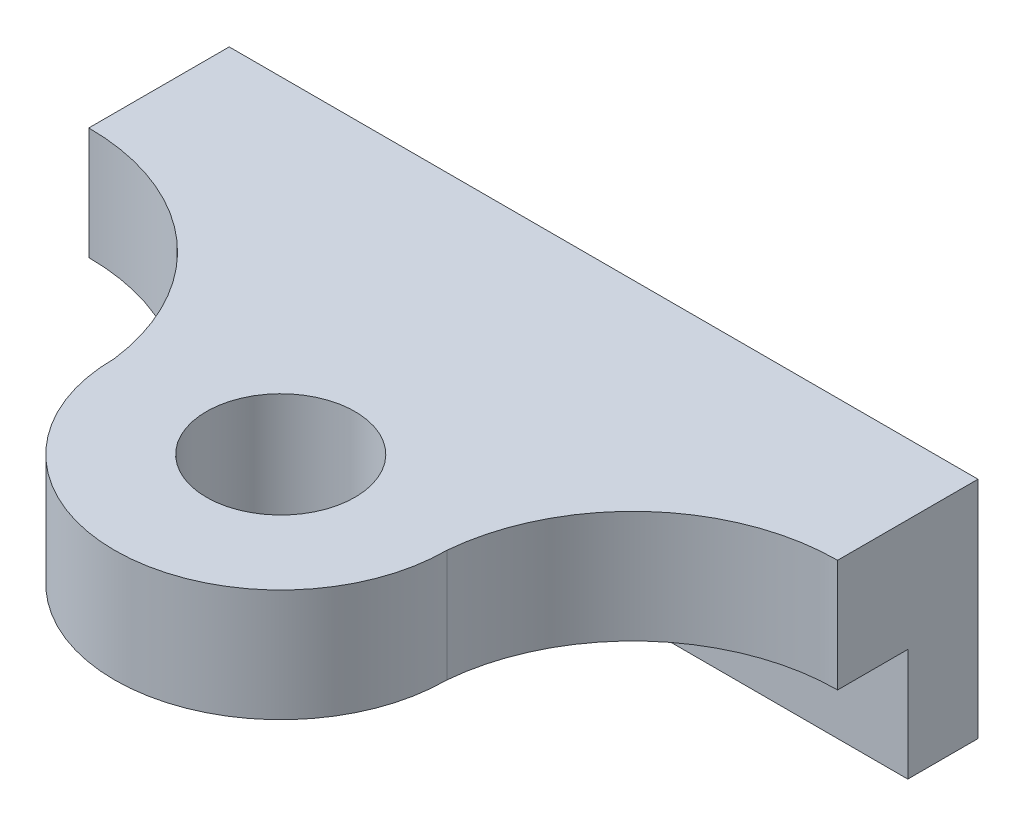
ISO-10303-21;
HEADER;
FILE_DESCRIPTION(('STEP AP214'),'2;1');
FILE_NAME('part.step','',(''),(''),'','','');
FILE_SCHEMA(('AUTOMOTIVE_DESIGN { 1 0 10303 214 1 1 1 1 }'));
ENDSEC;
DATA;
#1=APPLICATION_CONTEXT('core data for automotive mechanical design processes');
#2=APPLICATION_PROTOCOL_DEFINITION('international standard','automotive_design',2000,#1);
#3=PRODUCT_CONTEXT('',#1,'mechanical');
#4=PRODUCT('Part','Part','',(#3));
#5=PRODUCT_RELATED_PRODUCT_CATEGORY('part','',(#4));
#6=PRODUCT_DEFINITION_FORMATION('','',#4);
#7=PRODUCT_DEFINITION_CONTEXT('part definition',#1,'design');
#8=PRODUCT_DEFINITION('design','',#6,#7);
#9=PRODUCT_DEFINITION_SHAPE('','',#8);
#10=(LENGTH_UNIT() NAMED_UNIT(*) SI_UNIT(.MILLI.,.METRE.));
#11=(NAMED_UNIT(*) PLANE_ANGLE_UNIT() SI_UNIT($,.RADIAN.));
#12=(NAMED_UNIT(*) SI_UNIT($,.STERADIAN.) SOLID_ANGLE_UNIT());
#13=UNCERTAINTY_MEASURE_WITH_UNIT(LENGTH_MEASURE(1.E-05),#10,'distance_accuracy_value','');
#14=(GEOMETRIC_REPRESENTATION_CONTEXT(3) GLOBAL_UNCERTAINTY_ASSIGNED_CONTEXT((#13)) GLOBAL_UNIT_ASSIGNED_CONTEXT((#10,
#11,#12)) REPRESENTATION_CONTEXT('',''));
#15=CARTESIAN_POINT('',(0.,0.,0.));
#16=DIRECTION('',(0.,0.,1.));
#17=DIRECTION('',(1.,0.,0.));
#18=AXIS2_PLACEMENT_3D('',#15,#16,#17);
#19=CARTESIAN_POINT('',(0.,0.,0.));
#20=DIRECTION('',(0.,1.,0.));
#21=DIRECTION('',(0.,0.,1.));
#22=AXIS2_PLACEMENT_3D('',#19,#20,#21);
#23=PLANE('',#22);
#24=CARTESIAN_POINT('',(0.,0.,0.));
#25=DIRECTION('',(0.,1.,0.));
#26=DIRECTION('',(0.,0.,1.));
#27=AXIS2_PLACEMENT_3D('',#24,#25,#26);
#28=CIRCLE('',#27,7.94);
#29=CARTESIAN_POINT('',(0.,0.,7.94000000000001));
#30=VERTEX_POINT('',#29);
#31=EDGE_CURVE('E152',#30,#30,#28,.T.);
#32=ORIENTED_EDGE('',*,*,#31,.T.);
#33=EDGE_LOOP('',(#32));
#34=FACE_BOUND('',#33,.T.);
#35=DIRECTION('',(-1.,0.,0.));
#36=VECTOR('',#35,1.);
#37=CARTESIAN_POINT('',(39.5436750463733,0.,-27.4526818153237));
#38=LINE('',#37,#36);
#39=CARTESIAN_POINT('',(39.5436750463733,0.,-27.4526818153237));
#40=VERTEX_POINT('',#39);
#41=CARTESIAN_POINT('',(-40.4563249536267,0.,-27.4526818153237));
#42=VERTEX_POINT('',#41);
#43=EDGE_CURVE('E52',#40,#42,#38,.T.);
#44=ORIENTED_EDGE('',*,*,#43,.F.);
#45=DIRECTION('',(0.,0.,1.));
#46=VECTOR('',#45,1.);
#47=CARTESIAN_POINT('',(39.5436750463733,0.,-19.9526818153237));
#48=LINE('',#47,#46);
#49=CARTESIAN_POINT('',(39.5436750463733,0.,-19.9526818153237));
#50=VERTEX_POINT('',#49);
#51=EDGE_CURVE('E123',#40,#50,#48,.T.);
#52=ORIENTED_EDGE('',*,*,#51,.T.);
#53=CARTESIAN_POINT('',(39.5436750463733,0.,1.92592557518609));
#54=DIRECTION('',(0.,1.,0.));
#55=DIRECTION('',(0.,0.,1.));
#56=AXIS2_PLACEMENT_3D('',#53,#54,#55);
#57=CIRCLE('',#56,21.8786073905098);
#58=CARTESIAN_POINT('',(17.75,0.,0.));
#59=VERTEX_POINT('',#58);
#60=EDGE_CURVE('E167',#50,#59,#57,.T.);
#61=ORIENTED_EDGE('',*,*,#60,.T.);
#62=CARTESIAN_POINT('',(0.,0.,0.));
#63=DIRECTION('',(0.,1.,0.));
#64=DIRECTION('',(0.,0.,1.));
#65=AXIS2_PLACEMENT_3D('',#62,#63,#64);
#66=CIRCLE('',#65,17.75);
#67=CARTESIAN_POINT('',(-17.75,0.,0.));
#68=VERTEX_POINT('',#67);
#69=EDGE_CURVE('E44',#68,#59,#66,.T.);
#70=ORIENTED_EDGE('',*,*,#69,.F.);
#71=CARTESIAN_POINT('',(-40.4563249536267,0.,2.94365645589363));
#72=DIRECTION('',(0.,1.,0.));
#73=DIRECTION('',(0.,0.,-1.));
#74=AXIS2_PLACEMENT_3D('',#71,#72,#73);
#75=CIRCLE('',#74,22.8963382712174);
#76=CARTESIAN_POINT('',(-40.4563249536267,0.,-19.9526818153237));
#77=VERTEX_POINT('',#76);
#78=EDGE_CURVE('E171',#68,#77,#75,.T.);
#79=ORIENTED_EDGE('',*,*,#78,.T.);
#80=DIRECTION('',(0.,0.,-1.));
#81=VECTOR('',#80,1.);
#82=CARTESIAN_POINT('',(-40.4563249536266,0.,-19.9526818153237));
#83=LINE('',#82,#81);
#84=EDGE_CURVE('E124',#77,#42,#83,.T.);
#85=ORIENTED_EDGE('',*,*,#84,.T.);
#86=EDGE_LOOP('',(#44,#52,#61,#70,#79,#85));
#87=FACE_BOUND('',#86,.T.);
#88=ADVANCED_FACE('F35',(#34,#87),#23,.F.);
#89=CARTESIAN_POINT('',(0.,12.,0.));
#90=DIRECTION('',(0.,1.,0.));
#91=DIRECTION('',(0.,0.,1.));
#92=AXIS2_PLACEMENT_3D('',#89,#90,#91);
#93=PLANE('',#92);
#94=CARTESIAN_POINT('',(0.,12.,0.));
#95=DIRECTION('',(0.,1.,0.));
#96=DIRECTION('',(0.,0.,1.));
#97=AXIS2_PLACEMENT_3D('',#94,#95,#96);
#98=CIRCLE('',#97,17.75);
#99=CARTESIAN_POINT('',(-17.75,12.,0.));
#100=VERTEX_POINT('',#99);
#101=CARTESIAN_POINT('',(17.75,12.,0.));
#102=VERTEX_POINT('',#101);
#103=EDGE_CURVE('E11',#100,#102,#98,.T.);
#104=ORIENTED_EDGE('',*,*,#103,.T.);
#105=CARTESIAN_POINT('',(39.5436750463733,12.,1.92592557518609));
#106=DIRECTION('',(0.,1.,0.));
#107=DIRECTION('',(0.,0.,1.));
#108=AXIS2_PLACEMENT_3D('',#105,#106,#107);
#109=CIRCLE('',#108,21.8786073905098);
#110=CARTESIAN_POINT('',(39.5436750463733,12.,-19.9526818153237));
#111=VERTEX_POINT('',#110);
#112=EDGE_CURVE('E161',#111,#102,#109,.T.);
#113=ORIENTED_EDGE('',*,*,#112,.F.);
#114=DIRECTION('',(0.,0.,1.));
#115=VECTOR('',#114,1.);
#116=CARTESIAN_POINT('',(39.5436750463733,12.,-19.9526818153237));
#117=LINE('',#116,#115);
#118=CARTESIAN_POINT('',(39.5436750463733,12.,-34.9526818153237));
#119=VERTEX_POINT('',#118);
#120=EDGE_CURVE('E143',#119,#111,#117,.T.);
#121=ORIENTED_EDGE('',*,*,#120,.F.);
#122=DIRECTION('',(1.,0.,0.));
#123=VECTOR('',#122,1.);
#124=CARTESIAN_POINT('',(-40.4563249536266,12.,-34.9526818153237));
#125=LINE('',#124,#123);
#126=CARTESIAN_POINT('',(-40.4563249536266,12.,-34.9526818153237));
#127=VERTEX_POINT('',#126);
#128=EDGE_CURVE('E140',#127,#119,#125,.T.);
#129=ORIENTED_EDGE('',*,*,#128,.F.);
#130=DIRECTION('',(0.,0.,-1.));
#131=VECTOR('',#130,1.);
#132=CARTESIAN_POINT('',(-40.4563249536266,12.,-19.9526818153237));
#133=LINE('',#132,#131);
#134=CARTESIAN_POINT('',(-40.4563249536266,12.,-19.9526818153237));
#135=VERTEX_POINT('',#134);
#136=EDGE_CURVE('E137',#135,#127,#133,.T.);
#137=ORIENTED_EDGE('',*,*,#136,.F.);
#138=CARTESIAN_POINT('',(-40.4563249536267,12.,2.94365645589363));
#139=DIRECTION('',(0.,1.,0.));
#140=DIRECTION('',(0.,0.,-1.));
#141=AXIS2_PLACEMENT_3D('',#138,#139,#140);
#142=CIRCLE('',#141,22.8963382712174);
#143=EDGE_CURVE('E170',#100,#135,#142,.T.);
#144=ORIENTED_EDGE('',*,*,#143,.F.);
#145=EDGE_LOOP('',(#104,#113,#121,#129,#137,#144));
#146=FACE_BOUND('',#145,.T.);
#147=CARTESIAN_POINT('',(0.,12.,0.));
#148=DIRECTION('',(0.,1.,0.));
#149=DIRECTION('',(0.,0.,1.));
#150=AXIS2_PLACEMENT_3D('',#147,#148,#149);
#151=CIRCLE('',#150,7.94);
#152=CARTESIAN_POINT('',(0.,12.,7.94000000000001));
#153=VERTEX_POINT('',#152);
#154=EDGE_CURVE('E150',#153,#153,#151,.T.);
#155=ORIENTED_EDGE('',*,*,#154,.F.);
#156=EDGE_LOOP('',(#155));
#157=FACE_BOUND('',#156,.T.);
#158=ADVANCED_FACE('F186',(#146,#157),#93,.T.);
#159=CARTESIAN_POINT('',(0.,12.,0.));
#160=DIRECTION('',(0.,-1.,0.));
#161=DIRECTION('',(0.,0.,-1.));
#162=AXIS2_PLACEMENT_3D('',#159,#160,#161);
#163=CYLINDRICAL_SURFACE('',#162,17.75);
#164=ORIENTED_EDGE('',*,*,#69,.T.);
#165=DIRECTION('',(0.,-1.,0.));
#166=VECTOR('',#165,1.);
#167=CARTESIAN_POINT('',(17.75,12.,0.));
#168=LINE('',#167,#166);
#169=EDGE_CURVE('E155',#102,#59,#168,.T.);
#170=ORIENTED_EDGE('',*,*,#169,.F.);
#171=ORIENTED_EDGE('',*,*,#103,.F.);
#172=DIRECTION('',(0.,-1.,0.));
#173=VECTOR('',#172,1.);
#174=CARTESIAN_POINT('',(-17.75,12.,0.));
#175=LINE('',#174,#173);
#176=EDGE_CURVE('E158',#100,#68,#175,.T.);
#177=ORIENTED_EDGE('',*,*,#176,.T.);
#178=EDGE_LOOP('',(#164,#170,#171,#177));
#179=FACE_BOUND('',#178,.T.);
#180=ADVANCED_FACE('F37',(#179),#163,.T.);
#181=CARTESIAN_POINT('',(0.,12.,0.));
#182=DIRECTION('',(0.,-1.,0.));
#183=DIRECTION('',(0.,0.,-1.));
#184=AXIS2_PLACEMENT_3D('',#181,#182,#183);
#185=CYLINDRICAL_SURFACE('',#184,7.94);
#186=ORIENTED_EDGE('',*,*,#154,.T.);
#187=EDGE_LOOP('',(#186));
#188=FACE_BOUND('',#187,.T.);
#189=ORIENTED_EDGE('',*,*,#31,.F.);
#190=EDGE_LOOP('',(#189));
#191=FACE_BOUND('',#190,.T.);
#192=ADVANCED_FACE('F216',(#188,#191),#185,.F.);
#193=CARTESIAN_POINT('',(39.5436750463733,12.,1.92592557518609));
#194=DIRECTION('',(0.,-1.,0.));
#195=DIRECTION('',(0.,0.,-1.));
#196=AXIS2_PLACEMENT_3D('',#193,#194,#195);
#197=CYLINDRICAL_SURFACE('',#196,21.8786073905098);
#198=ORIENTED_EDGE('',*,*,#60,.F.);
#199=DIRECTION('',(0.,-1.,0.));
#200=VECTOR('',#199,1.);
#201=CARTESIAN_POINT('',(39.5436750463733,12.,-19.9526818153237));
#202=LINE('',#201,#200);
#203=EDGE_CURVE('E164',#111,#50,#202,.T.);
#204=ORIENTED_EDGE('',*,*,#203,.F.);
#205=ORIENTED_EDGE('',*,*,#112,.T.);
#206=ORIENTED_EDGE('',*,*,#169,.T.);
#207=EDGE_LOOP('',(#198,#204,#205,#206));
#208=FACE_BOUND('',#207,.T.);
#209=ADVANCED_FACE('F192',(#208),#197,.F.);
#210=CARTESIAN_POINT('',(-40.4563249536267,12.,2.94365645589363));
#211=DIRECTION('',(0.,-1.,0.));
#212=DIRECTION('',(0.,0.,-1.));
#213=AXIS2_PLACEMENT_3D('',#210,#211,#212);
#214=CYLINDRICAL_SURFACE('',#213,22.8963382712174);
#215=ORIENTED_EDGE('',*,*,#78,.F.);
#216=ORIENTED_EDGE('',*,*,#176,.F.);
#217=ORIENTED_EDGE('',*,*,#143,.T.);
#218=DIRECTION('',(0.,-1.,0.));
#219=VECTOR('',#218,1.);
#220=CARTESIAN_POINT('',(-40.4563249536267,12.,-19.9526818153237));
#221=LINE('',#220,#219);
#222=EDGE_CURVE('E160',#135,#77,#221,.T.);
#223=ORIENTED_EDGE('',*,*,#222,.T.);
#224=EDGE_LOOP('',(#215,#216,#217,#223));
#225=FACE_BOUND('',#224,.T.);
#226=ADVANCED_FACE('F196',(#225),#214,.F.);
#227=CARTESIAN_POINT('',(-40.4563249536266,12.,-19.9526818153237));
#228=DIRECTION('',(-1.,0.,0.));
#229=DIRECTION('',(0.,0.,1.));
#230=AXIS2_PLACEMENT_3D('',#227,#228,#229);
#231=PLANE('',#230);
#232=ORIENTED_EDGE('',*,*,#84,.F.);
#233=ORIENTED_EDGE('',*,*,#222,.F.);
#234=ORIENTED_EDGE('',*,*,#136,.T.);
#235=DIRECTION('',(0.,-1.,0.));
#236=VECTOR('',#235,1.);
#237=CARTESIAN_POINT('',(-40.4563249536266,12.,-34.9526818153237));
#238=LINE('',#237,#236);
#239=CARTESIAN_POINT('',(-40.4563249536266,-12.,-34.9526818153237));
#240=VERTEX_POINT('',#239);
#241=EDGE_CURVE('E145',#127,#240,#238,.T.);
#242=ORIENTED_EDGE('',*,*,#241,.T.);
#243=DIRECTION('',(0.,0.,-1.));
#244=VECTOR('',#243,1.);
#245=CARTESIAN_POINT('',(-40.4563249536266,-12.,-34.9526818153237));
#246=LINE('',#245,#244);
#247=CARTESIAN_POINT('',(-40.4563249536267,-12.,-27.4526818153237));
#248=VERTEX_POINT('',#247);
#249=EDGE_CURVE('E111',#248,#240,#246,.T.);
#250=ORIENTED_EDGE('',*,*,#249,.F.);
#251=DIRECTION('',(0.,1.,0.));
#252=VECTOR('',#251,1.);
#253=CARTESIAN_POINT('',(-40.4563249536267,-12.,-27.4526818153237));
#254=LINE('',#253,#252);
#255=EDGE_CURVE('E107',#248,#42,#254,.T.);
#256=ORIENTED_EDGE('',*,*,#255,.T.);
#257=EDGE_LOOP('',(#232,#233,#234,#242,#250,#256));
#258=FACE_BOUND('',#257,.T.);
#259=ADVANCED_FACE('F198',(#258),#231,.T.);
#260=CARTESIAN_POINT('',(39.5436750463733,12.,-19.9526818153237));
#261=DIRECTION('',(1.,0.,0.));
#262=DIRECTION('',(0.,0.,-1.));
#263=AXIS2_PLACEMENT_3D('',#260,#261,#262);
#264=PLANE('',#263);
#265=ORIENTED_EDGE('',*,*,#51,.F.);
#266=DIRECTION('',(0.,1.,0.));
#267=VECTOR('',#266,1.);
#268=CARTESIAN_POINT('',(39.5436750463733,-12.,-27.4526818153237));
#269=LINE('',#268,#267);
#270=CARTESIAN_POINT('',(39.5436750463733,-12.,-27.4526818153237));
#271=VERTEX_POINT('',#270);
#272=EDGE_CURVE('E105',#271,#40,#269,.T.);
#273=ORIENTED_EDGE('',*,*,#272,.F.);
#274=DIRECTION('',(0.,0.,1.));
#275=VECTOR('',#274,1.);
#276=CARTESIAN_POINT('',(39.5436750463733,-12.,-34.9526818153237));
#277=LINE('',#276,#275);
#278=CARTESIAN_POINT('',(39.5436750463733,-12.,-34.9526818153237));
#279=VERTEX_POINT('',#278);
#280=EDGE_CURVE('E112',#279,#271,#277,.T.);
#281=ORIENTED_EDGE('',*,*,#280,.F.);
#282=DIRECTION('',(0.,-1.,0.));
#283=VECTOR('',#282,1.);
#284=CARTESIAN_POINT('',(39.5436750463733,12.,-34.9526818153237));
#285=LINE('',#284,#283);
#286=EDGE_CURVE('E174',#119,#279,#285,.T.);
#287=ORIENTED_EDGE('',*,*,#286,.F.);
#288=ORIENTED_EDGE('',*,*,#120,.T.);
#289=ORIENTED_EDGE('',*,*,#203,.T.);
#290=EDGE_LOOP('',(#265,#273,#281,#287,#288,#289));
#291=FACE_BOUND('',#290,.T.);
#292=ADVANCED_FACE('F121',(#291),#264,.T.);
#293=CARTESIAN_POINT('',(-40.4563249536266,12.,-34.9526818153237));
#294=DIRECTION('',(0.,0.,-1.));
#295=DIRECTION('',(-1.,0.,0.));
#296=AXIS2_PLACEMENT_3D('',#293,#294,#295);
#297=PLANE('',#296);
#298=ORIENTED_EDGE('',*,*,#286,.T.);
#299=DIRECTION('',(1.,0.,0.));
#300=VECTOR('',#299,1.);
#301=CARTESIAN_POINT('',(39.5436750463733,-12.,-34.9526818153237));
#302=LINE('',#301,#300);
#303=EDGE_CURVE('E118',#240,#279,#302,.T.);
#304=ORIENTED_EDGE('',*,*,#303,.F.);
#305=ORIENTED_EDGE('',*,*,#241,.F.);
#306=ORIENTED_EDGE('',*,*,#128,.T.);
#307=EDGE_LOOP('',(#298,#304,#305,#306));
#308=FACE_BOUND('',#307,.T.);
#309=ADVANCED_FACE('F180',(#308),#297,.T.);
#310=CARTESIAN_POINT('',(39.5436750463733,-12.,-27.4526818153237));
#311=DIRECTION('',(0.,0.,-1.));
#312=DIRECTION('',(-1.,0.,0.));
#313=AXIS2_PLACEMENT_3D('',#310,#311,#312);
#314=PLANE('',#313);
#315=ORIENTED_EDGE('',*,*,#43,.T.);
#316=ORIENTED_EDGE('',*,*,#255,.F.);
#317=DIRECTION('',(-1.,0.,0.));
#318=VECTOR('',#317,1.);
#319=CARTESIAN_POINT('',(39.5436750463733,-12.,-27.4526818153237));
#320=LINE('',#319,#318);
#321=EDGE_CURVE('E101',#271,#248,#320,.T.);
#322=ORIENTED_EDGE('',*,*,#321,.F.);
#323=ORIENTED_EDGE('',*,*,#272,.T.);
#324=EDGE_LOOP('',(#315,#316,#322,#323));
#325=FACE_BOUND('',#324,.T.);
#326=ADVANCED_FACE('F103',(#325),#314,.F.);
#327=CARTESIAN_POINT('',(0.,-12.,0.));
#328=DIRECTION('',(0.,-1.,0.));
#329=DIRECTION('',(0.,0.,-1.));
#330=AXIS2_PLACEMENT_3D('',#327,#328,#329);
#331=PLANE('',#330);
#332=ORIENTED_EDGE('',*,*,#280,.T.);
#333=ORIENTED_EDGE('',*,*,#321,.T.);
#334=ORIENTED_EDGE('',*,*,#249,.T.);
#335=ORIENTED_EDGE('',*,*,#303,.T.);
#336=EDGE_LOOP('',(#332,#333,#334,#335));
#337=FACE_BOUND('',#336,.T.);
#338=ADVANCED_FACE('F116',(#337),#331,.T.);
#339=CLOSED_SHELL('',(#88,#158,#180,#192,#209,#226,#259,#292,#309,#326,#338));
#340=MANIFOLD_SOLID_BREP('B2',#339);
#341=ADVANCED_BREP_SHAPE_REPRESENTATION('',(#18,#340),#14);
#342=SHAPE_DEFINITION_REPRESENTATION(#9,#341);
ENDSEC;
END-ISO-10303-21;
